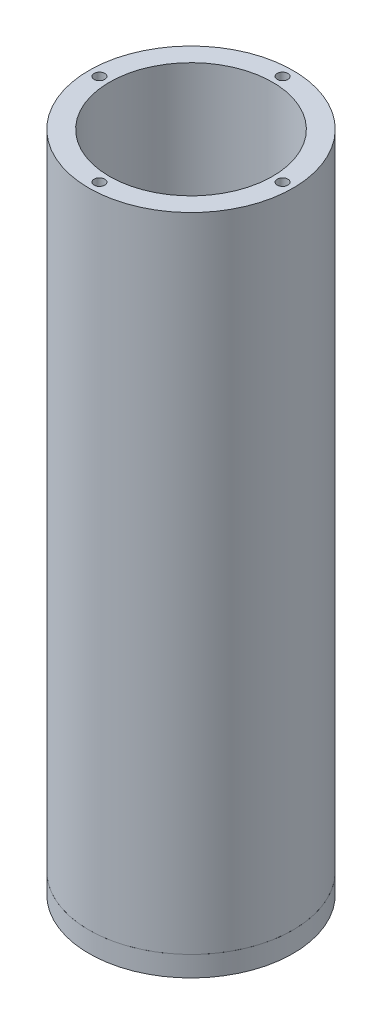
ISO-10303-21;
HEADER;
FILE_DESCRIPTION(('STEP AP214'),'2;1');
FILE_NAME('part.step','',(''),(''),'','','');
FILE_SCHEMA(('AUTOMOTIVE_DESIGN { 1 0 10303 214 1 1 1 1 }'));
ENDSEC;
DATA;
#1=APPLICATION_CONTEXT('core data for automotive mechanical design processes');
#2=APPLICATION_PROTOCOL_DEFINITION('international standard','automotive_design',2000,#1);
#3=PRODUCT_CONTEXT('',#1,'mechanical');
#4=PRODUCT('Part','Part','',(#3));
#5=PRODUCT_RELATED_PRODUCT_CATEGORY('part','',(#4));
#6=PRODUCT_DEFINITION_FORMATION('','',#4);
#7=PRODUCT_DEFINITION_CONTEXT('part definition',#1,'design');
#8=PRODUCT_DEFINITION('design','',#6,#7);
#9=PRODUCT_DEFINITION_SHAPE('','',#8);
#10=(LENGTH_UNIT() NAMED_UNIT(*) SI_UNIT(.MILLI.,.METRE.));
#11=(NAMED_UNIT(*) PLANE_ANGLE_UNIT() SI_UNIT($,.RADIAN.));
#12=(NAMED_UNIT(*) SI_UNIT($,.STERADIAN.) SOLID_ANGLE_UNIT());
#13=UNCERTAINTY_MEASURE_WITH_UNIT(LENGTH_MEASURE(1.E-05),#10,'distance_accuracy_value','');
#14=(GEOMETRIC_REPRESENTATION_CONTEXT(3) GLOBAL_UNCERTAINTY_ASSIGNED_CONTEXT((#13)) GLOBAL_UNIT_ASSIGNED_CONTEXT((#10,
#11,#12)) REPRESENTATION_CONTEXT('',''));
#15=CARTESIAN_POINT('',(0.,0.,0.));
#16=DIRECTION('',(0.,0.,1.));
#17=DIRECTION('',(1.,0.,0.));
#18=AXIS2_PLACEMENT_3D('',#15,#16,#17);
#19=CARTESIAN_POINT('',(0.,-6.35,0.));
#20=DIRECTION('',(0.,1.,0.));
#21=DIRECTION('',(0.,0.,1.));
#22=AXIS2_PLACEMENT_3D('',#19,#20,#21);
#23=CYLINDRICAL_SURFACE('',#22,31.75);
#24=CARTESIAN_POINT('',(0.,-6.35,0.));
#25=DIRECTION('',(0.,-1.,0.));
#26=DIRECTION('',(0.,0.,-1.));
#27=AXIS2_PLACEMENT_3D('',#24,#25,#26);
#28=CIRCLE('',#27,31.75);
#29=CARTESIAN_POINT('',(0.,-6.35,-31.75));
#30=VERTEX_POINT('',#29);
#31=EDGE_CURVE('E11',#30,#30,#28,.T.);
#32=ORIENTED_EDGE('',*,*,#31,.F.);
#33=EDGE_LOOP('',(#32));
#34=FACE_BOUND('',#33,.T.);
#35=CARTESIAN_POINT('',(0.,0.,0.));
#36=DIRECTION('',(0.,-1.,0.));
#37=DIRECTION('',(0.,0.,-1.));
#38=AXIS2_PLACEMENT_3D('',#35,#36,#37);
#39=CIRCLE('',#38,31.75);
#40=CARTESIAN_POINT('',(0.,0.,-31.75));
#41=VERTEX_POINT('',#40);
#42=EDGE_CURVE('E47',#41,#41,#39,.T.);
#43=ORIENTED_EDGE('',*,*,#42,.T.);
#44=EDGE_LOOP('',(#43));
#45=FACE_BOUND('',#44,.T.);
#46=ADVANCED_FACE('F44',(#34,#45),#23,.T.);
#47=CARTESIAN_POINT('',(0.,-6.35,0.));
#48=DIRECTION('',(0.,-1.,0.));
#49=DIRECTION('',(0.,0.,-1.));
#50=AXIS2_PLACEMENT_3D('',#47,#48,#49);
#51=PLANE('',#50);
#52=ORIENTED_EDGE('',*,*,#31,.T.);
#53=EDGE_LOOP('',(#52));
#54=FACE_BOUND('',#53,.T.);
#55=ADVANCED_FACE('F59',(#54),#51,.T.);
#56=CARTESIAN_POINT('',(0.,0.,0.));
#57=DIRECTION('',(0.,-1.,0.));
#58=DIRECTION('',(0.,0.,-1.));
#59=AXIS2_PLACEMENT_3D('',#56,#57,#58);
#60=PLANE('',#59);
#61=ORIENTED_EDGE('',*,*,#42,.F.);
#62=EDGE_LOOP('',(#61));
#63=FACE_BOUND('',#62,.T.);
#64=ADVANCED_FACE('F57',(#63),#60,.F.);
#65=CLOSED_SHELL('',(#46,#55,#64));
#66=MANIFOLD_SOLID_BREP('B2',#65);
#67=CARTESIAN_POINT('',(0.,200.,0.));
#68=DIRECTION('',(0.,1.,0.));
#69=DIRECTION('',(0.,0.,1.));
#70=AXIS2_PLACEMENT_3D('',#67,#68,#69);
#71=PLANE('',#70);
#72=CARTESIAN_POINT('',(0.,200.,-28.5));
#73=DIRECTION('',(0.,1.,0.));
#74=DIRECTION('',(0.,0.,1.));
#75=AXIS2_PLACEMENT_3D('',#72,#73,#74);
#76=CIRCLE('',#75,1.65);
#77=CARTESIAN_POINT('',(0.,200.,-26.85));
#78=VERTEX_POINT('',#77);
#79=EDGE_CURVE('E116',#78,#78,#76,.T.);
#80=ORIENTED_EDGE('',*,*,#79,.F.);
#81=EDGE_LOOP('',(#80));
#82=FACE_BOUND('',#81,.T.);
#83=CARTESIAN_POINT('',(28.5,200.,0.));
#84=DIRECTION('',(0.,1.,0.));
#85=DIRECTION('',(0.,0.,1.));
#86=AXIS2_PLACEMENT_3D('',#83,#84,#85);
#87=CIRCLE('',#86,1.65);
#88=CARTESIAN_POINT('',(28.5,200.,1.65));
#89=VERTEX_POINT('',#88);
#90=EDGE_CURVE('E115',#89,#89,#87,.T.);
#91=ORIENTED_EDGE('',*,*,#90,.F.);
#92=EDGE_LOOP('',(#91));
#93=FACE_BOUND('',#92,.T.);
#94=CARTESIAN_POINT('',(0.,200.,28.5));
#95=DIRECTION('',(0.,1.,0.));
#96=DIRECTION('',(0.,0.,1.));
#97=AXIS2_PLACEMENT_3D('',#94,#95,#96);
#98=CIRCLE('',#97,1.65);
#99=CARTESIAN_POINT('',(0.,200.,30.15));
#100=VERTEX_POINT('',#99);
#101=EDGE_CURVE('E126',#100,#100,#98,.T.);
#102=ORIENTED_EDGE('',*,*,#101,.F.);
#103=EDGE_LOOP('',(#102));
#104=FACE_BOUND('',#103,.T.);
#105=CARTESIAN_POINT('',(-28.5,200.,0.));
#106=DIRECTION('',(0.,1.,0.));
#107=DIRECTION('',(0.,0.,1.));
#108=AXIS2_PLACEMENT_3D('',#105,#106,#107);
#109=CIRCLE('',#108,1.65);
#110=CARTESIAN_POINT('',(-28.5,200.,1.65));
#111=VERTEX_POINT('',#110);
#112=EDGE_CURVE('E132',#111,#111,#109,.T.);
#113=ORIENTED_EDGE('',*,*,#112,.F.);
#114=EDGE_LOOP('',(#113));
#115=FACE_BOUND('',#114,.T.);
#116=CARTESIAN_POINT('',(0.,200.,0.));
#117=DIRECTION('',(0.,1.,0.));
#118=DIRECTION('',(0.,0.,1.));
#119=AXIS2_PLACEMENT_3D('',#116,#117,#118);
#120=CIRCLE('',#119,31.75);
#121=CARTESIAN_POINT('',(0.,200.,31.75));
#122=VERTEX_POINT('',#121);
#123=EDGE_CURVE('E42',#122,#122,#120,.T.);
#124=ORIENTED_EDGE('',*,*,#123,.T.);
#125=EDGE_LOOP('',(#124));
#126=FACE_BOUND('',#125,.T.);
#127=CARTESIAN_POINT('',(0.,200.,0.));
#128=DIRECTION('',(0.,1.,0.));
#129=DIRECTION('',(0.,0.,1.));
#130=AXIS2_PLACEMENT_3D('',#127,#128,#129);
#131=CIRCLE('',#130,25.4);
#132=CARTESIAN_POINT('',(0.,200.,25.4));
#133=VERTEX_POINT('',#132);
#134=EDGE_CURVE('E139',#133,#133,#131,.T.);
#135=ORIENTED_EDGE('',*,*,#134,.F.);
#136=EDGE_LOOP('',(#135));
#137=FACE_BOUND('',#136,.T.);
#138=ADVANCED_FACE('F84',(#82,#93,#104,#115,#126,#137),#71,.T.);
#139=CARTESIAN_POINT('',(0.,0.,0.));
#140=DIRECTION('',(0.,1.,0.));
#141=DIRECTION('',(0.,0.,1.));
#142=AXIS2_PLACEMENT_3D('',#139,#140,#141);
#143=PLANE('',#142);
#144=CARTESIAN_POINT('',(0.,0.,0.));
#145=DIRECTION('',(0.,1.,0.));
#146=DIRECTION('',(0.,0.,1.));
#147=AXIS2_PLACEMENT_3D('',#144,#145,#146);
#148=CIRCLE('',#147,31.75);
#149=CARTESIAN_POINT('',(0.,0.,31.75));
#150=VERTEX_POINT('',#149);
#151=EDGE_CURVE('E88',#150,#150,#148,.T.);
#152=ORIENTED_EDGE('',*,*,#151,.F.);
#153=EDGE_LOOP('',(#152));
#154=FACE_BOUND('',#153,.T.);
#155=CARTESIAN_POINT('',(0.,0.,0.));
#156=DIRECTION('',(0.,1.,0.));
#157=DIRECTION('',(0.,0.,1.));
#158=AXIS2_PLACEMENT_3D('',#155,#156,#157);
#159=CIRCLE('',#158,25.4);
#160=CARTESIAN_POINT('',(0.,0.,25.4));
#161=VERTEX_POINT('',#160);
#162=EDGE_CURVE('E138',#161,#161,#159,.T.);
#163=ORIENTED_EDGE('',*,*,#162,.T.);
#164=EDGE_LOOP('',(#163));
#165=FACE_BOUND('',#164,.T.);
#166=ADVANCED_FACE('F145',(#154,#165),#143,.F.);
#167=CARTESIAN_POINT('',(0.,200.,0.));
#168=DIRECTION('',(0.,-1.,0.));
#169=DIRECTION('',(0.,0.,-1.));
#170=AXIS2_PLACEMENT_3D('',#167,#168,#169);
#171=CYLINDRICAL_SURFACE('',#170,31.75);
#172=ORIENTED_EDGE('',*,*,#123,.F.);
#173=EDGE_LOOP('',(#172));
#174=FACE_BOUND('',#173,.T.);
#175=ORIENTED_EDGE('',*,*,#151,.T.);
#176=EDGE_LOOP('',(#175));
#177=FACE_BOUND('',#176,.T.);
#178=ADVANCED_FACE('F86',(#174,#177),#171,.T.);
#179=CARTESIAN_POINT('',(0.,200.,0.));
#180=DIRECTION('',(0.,-1.,0.));
#181=DIRECTION('',(0.,0.,-1.));
#182=AXIS2_PLACEMENT_3D('',#179,#180,#181);
#183=CYLINDRICAL_SURFACE('',#182,25.4);
#184=ORIENTED_EDGE('',*,*,#134,.T.);
#185=EDGE_LOOP('',(#184));
#186=FACE_BOUND('',#185,.T.);
#187=ORIENTED_EDGE('',*,*,#162,.F.);
#188=EDGE_LOOP('',(#187));
#189=FACE_BOUND('',#188,.T.);
#190=ADVANCED_FACE('F147',(#186,#189),#183,.F.);
#191=CARTESIAN_POINT('',(-28.5,189.9,0.));
#192=DIRECTION('',(0.,1.,0.));
#193=DIRECTION('',(0.,0.,1.));
#194=AXIS2_PLACEMENT_3D('',#191,#192,#193);
#195=CONICAL_SURFACE('',#194,1.65,1.02974425867665);
#196=CARTESIAN_POINT('',(-28.5,188.908579978605,0.));
#197=VERTEX_POINT('',#196);
#198=VERTEX_LOOP('',#197);
#199=FACE_BOUND('',#198,.T.);
#200=CARTESIAN_POINT('',(-28.5,189.9,0.));
#201=DIRECTION('',(0.,1.,0.));
#202=DIRECTION('',(0.,0.,1.));
#203=AXIS2_PLACEMENT_3D('',#200,#201,#202);
#204=CIRCLE('',#203,1.65);
#205=CARTESIAN_POINT('',(-28.5,189.9,1.65));
#206=VERTEX_POINT('',#205);
#207=EDGE_CURVE('E135',#206,#206,#204,.T.);
#208=ORIENTED_EDGE('',*,*,#207,.T.);
#209=EDGE_LOOP('',(#208));
#210=FACE_BOUND('',#209,.T.);
#211=ADVANCED_FACE('F149',(#199,#210),#195,.F.);
#212=CARTESIAN_POINT('',(-28.5,200.,0.));
#213=DIRECTION('',(0.,1.,0.));
#214=DIRECTION('',(0.,0.,1.));
#215=AXIS2_PLACEMENT_3D('',#212,#213,#214);
#216=CYLINDRICAL_SURFACE('',#215,1.65);
#217=ORIENTED_EDGE('',*,*,#207,.F.);
#218=EDGE_LOOP('',(#217));
#219=FACE_BOUND('',#218,.T.);
#220=ORIENTED_EDGE('',*,*,#112,.T.);
#221=EDGE_LOOP('',(#220));
#222=FACE_BOUND('',#221,.T.);
#223=ADVANCED_FACE('F156',(#219,#222),#216,.F.);
#224=CARTESIAN_POINT('',(0.,189.9,28.5));
#225=DIRECTION('',(0.,1.,0.));
#226=DIRECTION('',(0.,0.,1.));
#227=AXIS2_PLACEMENT_3D('',#224,#225,#226);
#228=CONICAL_SURFACE('',#227,1.65,1.02974425867665);
#229=CARTESIAN_POINT('',(0.,188.908579978605,28.5));
#230=VERTEX_POINT('',#229);
#231=VERTEX_LOOP('',#230);
#232=FACE_BOUND('',#231,.T.);
#233=CARTESIAN_POINT('',(0.,189.9,28.5));
#234=DIRECTION('',(0.,1.,0.));
#235=DIRECTION('',(0.,0.,1.));
#236=AXIS2_PLACEMENT_3D('',#233,#234,#235);
#237=CIRCLE('',#236,1.65);
#238=CARTESIAN_POINT('',(0.,189.9,30.15));
#239=VERTEX_POINT('',#238);
#240=EDGE_CURVE('E129',#239,#239,#237,.T.);
#241=ORIENTED_EDGE('',*,*,#240,.T.);
#242=EDGE_LOOP('',(#241));
#243=FACE_BOUND('',#242,.T.);
#244=ADVANCED_FACE('F182',(#232,#243),#228,.F.);
#245=CARTESIAN_POINT('',(0.,200.,28.5));
#246=DIRECTION('',(0.,1.,0.));
#247=DIRECTION('',(0.,0.,1.));
#248=AXIS2_PLACEMENT_3D('',#245,#246,#247);
#249=CYLINDRICAL_SURFACE('',#248,1.65);
#250=ORIENTED_EDGE('',*,*,#240,.F.);
#251=EDGE_LOOP('',(#250));
#252=FACE_BOUND('',#251,.T.);
#253=ORIENTED_EDGE('',*,*,#101,.T.);
#254=EDGE_LOOP('',(#253));
#255=FACE_BOUND('',#254,.T.);
#256=ADVANCED_FACE('F188',(#252,#255),#249,.F.);
#257=CARTESIAN_POINT('',(28.5,189.9,0.));
#258=DIRECTION('',(0.,1.,0.));
#259=DIRECTION('',(0.,0.,1.));
#260=AXIS2_PLACEMENT_3D('',#257,#258,#259);
#261=CONICAL_SURFACE('',#260,1.65,1.02974425867665);
#262=CARTESIAN_POINT('',(28.5,188.908579978605,0.));
#263=VERTEX_POINT('',#262);
#264=VERTEX_LOOP('',#263);
#265=FACE_BOUND('',#264,.T.);
#266=CARTESIAN_POINT('',(28.5,189.9,0.));
#267=DIRECTION('',(0.,1.,0.));
#268=DIRECTION('',(0.,0.,1.));
#269=AXIS2_PLACEMENT_3D('',#266,#267,#268);
#270=CIRCLE('',#269,1.65);
#271=CARTESIAN_POINT('',(28.5,189.9,1.65));
#272=VERTEX_POINT('',#271);
#273=EDGE_CURVE('E119',#272,#272,#270,.T.);
#274=ORIENTED_EDGE('',*,*,#273,.T.);
#275=EDGE_LOOP('',(#274));
#276=FACE_BOUND('',#275,.T.);
#277=ADVANCED_FACE('F194',(#265,#276),#261,.F.);
#278=CARTESIAN_POINT('',(28.5,200.,0.));
#279=DIRECTION('',(0.,1.,0.));
#280=DIRECTION('',(0.,0.,1.));
#281=AXIS2_PLACEMENT_3D('',#278,#279,#280);
#282=CYLINDRICAL_SURFACE('',#281,1.65);
#283=ORIENTED_EDGE('',*,*,#273,.F.);
#284=EDGE_LOOP('',(#283));
#285=FACE_BOUND('',#284,.T.);
#286=ORIENTED_EDGE('',*,*,#90,.T.);
#287=EDGE_LOOP('',(#286));
#288=FACE_BOUND('',#287,.T.);
#289=ADVANCED_FACE('F109',(#285,#288),#282,.F.);
#290=CARTESIAN_POINT('',(0.,189.9,-28.5));
#291=DIRECTION('',(0.,1.,0.));
#292=DIRECTION('',(0.,0.,1.));
#293=AXIS2_PLACEMENT_3D('',#290,#291,#292);
#294=CONICAL_SURFACE('',#293,1.65,1.02974425867665);
#295=CARTESIAN_POINT('',(0.,188.908579978605,-28.5));
#296=VERTEX_POINT('',#295);
#297=VERTEX_LOOP('',#296);
#298=FACE_BOUND('',#297,.T.);
#299=CARTESIAN_POINT('',(0.,189.9,-28.5));
#300=DIRECTION('',(0.,1.,0.));
#301=DIRECTION('',(0.,0.,1.));
#302=AXIS2_PLACEMENT_3D('',#299,#300,#301);
#303=CIRCLE('',#302,1.65);
#304=CARTESIAN_POINT('',(0.,189.9,-26.85));
#305=VERTEX_POINT('',#304);
#306=EDGE_CURVE('E113',#305,#305,#303,.T.);
#307=ORIENTED_EDGE('',*,*,#306,.T.);
#308=EDGE_LOOP('',(#307));
#309=FACE_BOUND('',#308,.T.);
#310=ADVANCED_FACE('F105',(#298,#309),#294,.F.);
#311=CARTESIAN_POINT('',(0.,200.,-28.5));
#312=DIRECTION('',(0.,1.,0.));
#313=DIRECTION('',(0.,0.,1.));
#314=AXIS2_PLACEMENT_3D('',#311,#312,#313);
#315=CYLINDRICAL_SURFACE('',#314,1.65);
#316=ORIENTED_EDGE('',*,*,#306,.F.);
#317=EDGE_LOOP('',(#316));
#318=FACE_BOUND('',#317,.T.);
#319=ORIENTED_EDGE('',*,*,#79,.T.);
#320=EDGE_LOOP('',(#319));
#321=FACE_BOUND('',#320,.T.);
#322=ADVANCED_FACE('F108',(#318,#321),#315,.F.);
#323=CLOSED_SHELL('',(#138,#166,#178,#190,#211,#223,#244,#256,#277,#289,#310,#322));
#324=MANIFOLD_SOLID_BREP('B6',#323);
#325=ADVANCED_BREP_SHAPE_REPRESENTATION('',(#18,#66,#324),#14);
#326=SHAPE_DEFINITION_REPRESENTATION(#9,#325);
ENDSEC;
END-ISO-10303-21;
